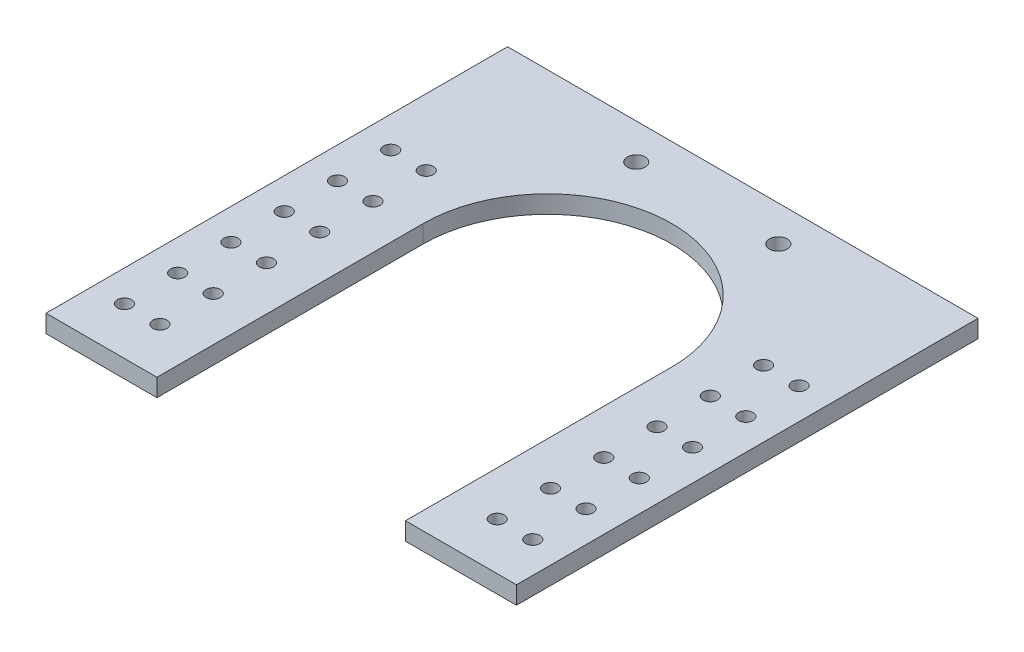
ISO-10303-21;
HEADER;
FILE_DESCRIPTION(('STEP AP214'),'2;1');
FILE_NAME('part.step','',(''),(''),'','','');
FILE_SCHEMA(('AUTOMOTIVE_DESIGN { 1 0 10303 214 1 1 1 1 }'));
ENDSEC;
DATA;
#1=APPLICATION_CONTEXT('core data for automotive mechanical design processes');
#2=APPLICATION_PROTOCOL_DEFINITION('international standard','automotive_design',2000,#1);
#3=PRODUCT_CONTEXT('',#1,'mechanical');
#4=PRODUCT('Part','Part','',(#3));
#5=PRODUCT_RELATED_PRODUCT_CATEGORY('part','',(#4));
#6=PRODUCT_DEFINITION_FORMATION('','',#4);
#7=PRODUCT_DEFINITION_CONTEXT('part definition',#1,'design');
#8=PRODUCT_DEFINITION('design','',#6,#7);
#9=PRODUCT_DEFINITION_SHAPE('','',#8);
#10=(LENGTH_UNIT() NAMED_UNIT(*) SI_UNIT(.MILLI.,.METRE.));
#11=(NAMED_UNIT(*) PLANE_ANGLE_UNIT() SI_UNIT($,.RADIAN.));
#12=(NAMED_UNIT(*) SI_UNIT($,.STERADIAN.) SOLID_ANGLE_UNIT());
#13=UNCERTAINTY_MEASURE_WITH_UNIT(LENGTH_MEASURE(1.E-05),#10,'distance_accuracy_value','');
#14=(GEOMETRIC_REPRESENTATION_CONTEXT(3) GLOBAL_UNCERTAINTY_ASSIGNED_CONTEXT((#13)) GLOBAL_UNIT_ASSIGNED_CONTEXT((#10,
#11,#12)) REPRESENTATION_CONTEXT('',''));
#15=CARTESIAN_POINT('',(0.,0.,0.));
#16=DIRECTION('',(0.,0.,1.));
#17=DIRECTION('',(1.,0.,0.));
#18=AXIS2_PLACEMENT_3D('',#15,#16,#17);
#19=CARTESIAN_POINT('',(0.,3.175,0.));
#20=DIRECTION('',(0.,-1.,0.));
#21=DIRECTION('',(0.,0.,-1.));
#22=AXIS2_PLACEMENT_3D('',#19,#20,#21);
#23=PLANE('',#22);
#24=CARTESIAN_POINT('',(60.325,3.175,8.45370510773183));
#25=DIRECTION('',(0.,1.,0.));
#26=DIRECTION('',(0.,0.,1.));
#27=AXIS2_PLACEMENT_3D('',#24,#25,#26);
#28=CIRCLE('',#27,2.55269999999999);
#29=CARTESIAN_POINT('',(60.325,3.175,11.0064051077318));
#30=VERTEX_POINT('',#29);
#31=EDGE_CURVE('E304',#30,#30,#28,.T.);
#32=ORIENTED_EDGE('',*,*,#31,.F.);
#33=EDGE_LOOP('',(#32));
#34=FACE_BOUND('',#33,.T.);
#35=CARTESIAN_POINT('',(73.025,3.175,65.6037051077318));
#36=DIRECTION('',(0.,1.,0.));
#37=DIRECTION('',(0.,0.,1.));
#38=AXIS2_PLACEMENT_3D('',#35,#36,#37);
#39=CIRCLE('',#38,2.55269999999999);
#40=CARTESIAN_POINT('',(73.025,3.175,68.1564051077318));
#41=VERTEX_POINT('',#40);
#42=EDGE_CURVE('E284',#41,#41,#39,.T.);
#43=ORIENTED_EDGE('',*,*,#42,.F.);
#44=EDGE_LOOP('',(#43));
#45=FACE_BOUND('',#44,.T.);
#46=CARTESIAN_POINT('',(60.325,3.175,65.6037051077318));
#47=DIRECTION('',(0.,1.,0.));
#48=DIRECTION('',(0.,0.,1.));
#49=AXIS2_PLACEMENT_3D('',#46,#47,#48);
#50=CIRCLE('',#49,2.55269999999999);
#51=CARTESIAN_POINT('',(60.325,3.175,68.1564051077318));
#52=VERTEX_POINT('',#51);
#53=EDGE_CURVE('E283',#52,#52,#50,.T.);
#54=ORIENTED_EDGE('',*,*,#53,.F.);
#55=EDGE_LOOP('',(#54));
#56=FACE_BOUND('',#55,.T.);
#57=CARTESIAN_POINT('',(-60.325,3.175,46.5537051077318));
#58=DIRECTION('',(0.,1.,0.));
#59=DIRECTION('',(0.,0.,1.));
#60=AXIS2_PLACEMENT_3D('',#57,#58,#59);
#61=CIRCLE('',#60,2.5527);
#62=CARTESIAN_POINT('',(-60.325,3.175,49.1064051077318));
#63=VERTEX_POINT('',#62);
#64=EDGE_CURVE('E372',#63,#63,#61,.T.);
#65=ORIENTED_EDGE('',*,*,#64,.F.);
#66=EDGE_LOOP('',(#65));
#67=FACE_BOUND('',#66,.T.);
#68=CARTESIAN_POINT('',(-73.025,3.175,46.5537051077318));
#69=DIRECTION('',(0.,1.,0.));
#70=DIRECTION('',(0.,0.,1.));
#71=AXIS2_PLACEMENT_3D('',#68,#69,#70);
#72=CIRCLE('',#71,2.55269999999999);
#73=CARTESIAN_POINT('',(-73.025,3.175,49.1064051077318));
#74=VERTEX_POINT('',#73);
#75=EDGE_CURVE('E380',#74,#74,#72,.T.);
#76=ORIENTED_EDGE('',*,*,#75,.F.);
#77=EDGE_LOOP('',(#76));
#78=FACE_BOUND('',#77,.T.);
#79=CARTESIAN_POINT('',(-73.025,3.175,65.6037051077318));
#80=DIRECTION('',(0.,1.,0.));
#81=DIRECTION('',(0.,0.,1.));
#82=AXIS2_PLACEMENT_3D('',#79,#80,#81);
#83=CIRCLE('',#82,2.55269999999999);
#84=CARTESIAN_POINT('',(-73.025,3.175,68.1564051077318));
#85=VERTEX_POINT('',#84);
#86=EDGE_CURVE('E220',#85,#85,#83,.T.);
#87=ORIENTED_EDGE('',*,*,#86,.F.);
#88=EDGE_LOOP('',(#87));
#89=FACE_BOUND('',#88,.T.);
#90=CARTESIAN_POINT('',(-60.325,3.175,65.6037051077318));
#91=DIRECTION('',(0.,1.,0.));
#92=DIRECTION('',(0.,0.,1.));
#93=AXIS2_PLACEMENT_3D('',#90,#91,#92);
#94=CIRCLE('',#93,2.5527);
#95=CARTESIAN_POINT('',(-60.325,3.175,68.1564051077318));
#96=VERTEX_POINT('',#95);
#97=EDGE_CURVE('E219',#96,#96,#94,.T.);
#98=ORIENTED_EDGE('',*,*,#97,.F.);
#99=EDGE_LOOP('',(#98));
#100=FACE_BOUND('',#99,.T.);
#101=CARTESIAN_POINT('',(-25.4,3.175,-69.85));
#102=DIRECTION('',(0.,1.,0.));
#103=DIRECTION('',(0.,0.,1.));
#104=AXIS2_PLACEMENT_3D('',#101,#102,#103);
#105=CIRCLE('',#104,3.175);
#106=CARTESIAN_POINT('',(-25.4,3.175,-66.675));
#107=VERTEX_POINT('',#106);
#108=EDGE_CURVE('E214',#107,#107,#105,.T.);
#109=ORIENTED_EDGE('',*,*,#108,.F.);
#110=EDGE_LOOP('',(#109));
#111=FACE_BOUND('',#110,.T.);
#112=CARTESIAN_POINT('',(25.4,3.175,-69.85));
#113=DIRECTION('',(0.,1.,0.));
#114=DIRECTION('',(0.,0.,1.));
#115=AXIS2_PLACEMENT_3D('',#112,#113,#114);
#116=CIRCLE('',#115,3.175);
#117=CARTESIAN_POINT('',(25.4,3.175,-66.675));
#118=VERTEX_POINT('',#117);
#119=EDGE_CURVE('E150',#118,#118,#116,.T.);
#120=ORIENTED_EDGE('',*,*,#119,.F.);
#121=EDGE_LOOP('',(#120));
#122=FACE_BOUND('',#121,.T.);
#123=DIRECTION('',(0.,0.,1.));
#124=VECTOR('',#123,1.);
#125=CARTESIAN_POINT('',(44.45,3.175,0.));
#126=LINE('',#125,#124);
#127=CARTESIAN_POINT('',(44.45,3.175,-12.7));
#128=VERTEX_POINT('',#127);
#129=CARTESIAN_POINT('',(44.45,3.175,82.55));
#130=VERTEX_POINT('',#129);
#131=EDGE_CURVE('E130',#128,#130,#126,.T.);
#132=ORIENTED_EDGE('',*,*,#131,.T.);
#133=DIRECTION('',(1.,0.,0.));
#134=VECTOR('',#133,1.);
#135=CARTESIAN_POINT('',(-84.1375,3.175,82.55));
#136=LINE('',#135,#134);
#137=CARTESIAN_POINT('',(84.1375,3.175,82.55));
#138=VERTEX_POINT('',#137);
#139=EDGE_CURVE('E179',#130,#138,#136,.T.);
#140=ORIENTED_EDGE('',*,*,#139,.T.);
#141=DIRECTION('',(0.,0.,-1.));
#142=VECTOR('',#141,1.);
#143=CARTESIAN_POINT('',(84.1375,3.175,82.55));
#144=LINE('',#143,#142);
#145=CARTESIAN_POINT('',(84.1375,3.175,-82.55));
#146=VERTEX_POINT('',#145);
#147=EDGE_CURVE('E176',#138,#146,#144,.T.);
#148=ORIENTED_EDGE('',*,*,#147,.T.);
#149=DIRECTION('',(1.,0.,0.));
#150=VECTOR('',#149,1.);
#151=CARTESIAN_POINT('',(-84.1375,3.175,-82.55));
#152=LINE('',#151,#150);
#153=CARTESIAN_POINT('',(-84.1375,3.175,-82.55));
#154=VERTEX_POINT('',#153);
#155=EDGE_CURVE('E172',#154,#146,#152,.T.);
#156=ORIENTED_EDGE('',*,*,#155,.F.);
#157=DIRECTION('',(0.,0.,-1.));
#158=VECTOR('',#157,1.);
#159=CARTESIAN_POINT('',(-84.1375,3.175,82.55));
#160=LINE('',#159,#158);
#161=CARTESIAN_POINT('',(-84.1375,3.175,82.55));
#162=VERTEX_POINT('',#161);
#163=EDGE_CURVE('E169',#162,#154,#160,.T.);
#164=ORIENTED_EDGE('',*,*,#163,.F.);
#165=CARTESIAN_POINT('',(-44.45,3.175,82.55));
#166=VERTEX_POINT('',#165);
#167=EDGE_CURVE('E180',#162,#166,#136,.T.);
#168=ORIENTED_EDGE('',*,*,#167,.T.);
#169=DIRECTION('',(0.,0.,-1.));
#170=VECTOR('',#169,1.);
#171=CARTESIAN_POINT('',(-44.45,3.175,0.));
#172=LINE('',#171,#170);
#173=CARTESIAN_POINT('',(-44.45,3.175,-12.7));
#174=VERTEX_POINT('',#173);
#175=EDGE_CURVE('E156',#166,#174,#172,.T.);
#176=ORIENTED_EDGE('',*,*,#175,.T.);
#177=CARTESIAN_POINT('',(0.,3.175,-12.7));
#178=DIRECTION('',(0.,1.,0.));
#179=DIRECTION('',(0.,0.,1.));
#180=AXIS2_PLACEMENT_3D('',#177,#178,#179);
#181=CIRCLE('',#180,44.45);
#182=EDGE_CURVE('E127',#128,#174,#181,.T.);
#183=ORIENTED_EDGE('',*,*,#182,.F.);
#184=EDGE_LOOP('',(#132,#140,#148,#156,#164,#168,#176,#183));
#185=FACE_BOUND('',#184,.T.);
#186=CARTESIAN_POINT('',(-73.025,3.175,27.5037051077318));
#187=DIRECTION('',(0.,1.,0.));
#188=DIRECTION('',(0.,0.,1.));
#189=AXIS2_PLACEMENT_3D('',#186,#187,#188);
#190=CIRCLE('',#189,2.55269999999999);
#191=CARTESIAN_POINT('',(-73.025,3.175,30.0564051077318));
#192=VERTEX_POINT('',#191);
#193=EDGE_CURVE('E224',#192,#192,#190,.T.);
#194=ORIENTED_EDGE('',*,*,#193,.F.);
#195=EDGE_LOOP('',(#194));
#196=FACE_BOUND('',#195,.T.);
#197=CARTESIAN_POINT('',(-73.025,3.175,8.45370510773183));
#198=DIRECTION('',(0.,1.,0.));
#199=DIRECTION('',(0.,0.,1.));
#200=AXIS2_PLACEMENT_3D('',#197,#198,#199);
#201=CIRCLE('',#200,2.55269999999999);
#202=CARTESIAN_POINT('',(-73.025,3.175,11.0064051077318));
#203=VERTEX_POINT('',#202);
#204=EDGE_CURVE('E232',#203,#203,#201,.T.);
#205=ORIENTED_EDGE('',*,*,#204,.F.);
#206=EDGE_LOOP('',(#205));
#207=FACE_BOUND('',#206,.T.);
#208=CARTESIAN_POINT('',(-73.025,3.175,-10.5962948922682));
#209=DIRECTION('',(0.,1.,0.));
#210=DIRECTION('',(0.,0.,1.));
#211=AXIS2_PLACEMENT_3D('',#208,#209,#210);
#212=CIRCLE('',#211,2.55269999999999);
#213=CARTESIAN_POINT('',(-73.025,3.175,-8.04359489226818));
#214=VERTEX_POINT('',#213);
#215=EDGE_CURVE('E240',#214,#214,#212,.T.);
#216=ORIENTED_EDGE('',*,*,#215,.F.);
#217=EDGE_LOOP('',(#216));
#218=FACE_BOUND('',#217,.T.);
#219=CARTESIAN_POINT('',(-73.025,3.175,-29.6462948922682));
#220=DIRECTION('',(0.,1.,0.));
#221=DIRECTION('',(0.,0.,1.));
#222=AXIS2_PLACEMENT_3D('',#219,#220,#221);
#223=CIRCLE('',#222,2.55269999999999);
#224=CARTESIAN_POINT('',(-73.025,3.175,-27.0935948922682));
#225=VERTEX_POINT('',#224);
#226=EDGE_CURVE('E248',#225,#225,#223,.T.);
#227=ORIENTED_EDGE('',*,*,#226,.F.);
#228=EDGE_LOOP('',(#227));
#229=FACE_BOUND('',#228,.T.);
#230=CARTESIAN_POINT('',(-60.325,3.175,27.5037051077318));
#231=DIRECTION('',(0.,1.,0.));
#232=DIRECTION('',(0.,0.,1.));
#233=AXIS2_PLACEMENT_3D('',#230,#231,#232);
#234=CIRCLE('',#233,2.5527);
#235=CARTESIAN_POINT('',(-60.325,3.175,30.0564051077318));
#236=VERTEX_POINT('',#235);
#237=EDGE_CURVE('E256',#236,#236,#234,.T.);
#238=ORIENTED_EDGE('',*,*,#237,.F.);
#239=EDGE_LOOP('',(#238));
#240=FACE_BOUND('',#239,.T.);
#241=CARTESIAN_POINT('',(-60.325,3.175,8.45370510773183));
#242=DIRECTION('',(0.,1.,0.));
#243=DIRECTION('',(0.,0.,1.));
#244=AXIS2_PLACEMENT_3D('',#241,#242,#243);
#245=CIRCLE('',#244,2.5527);
#246=CARTESIAN_POINT('',(-60.325,3.175,11.0064051077318));
#247=VERTEX_POINT('',#246);
#248=EDGE_CURVE('E264',#247,#247,#245,.T.);
#249=ORIENTED_EDGE('',*,*,#248,.F.);
#250=EDGE_LOOP('',(#249));
#251=FACE_BOUND('',#250,.T.);
#252=CARTESIAN_POINT('',(-60.325,3.175,-10.5962948922682));
#253=DIRECTION('',(0.,1.,0.));
#254=DIRECTION('',(0.,0.,1.));
#255=AXIS2_PLACEMENT_3D('',#252,#253,#254);
#256=CIRCLE('',#255,2.5527);
#257=CARTESIAN_POINT('',(-60.325,3.175,-8.04359489226817));
#258=VERTEX_POINT('',#257);
#259=EDGE_CURVE('E272',#258,#258,#256,.T.);
#260=ORIENTED_EDGE('',*,*,#259,.F.);
#261=EDGE_LOOP('',(#260));
#262=FACE_BOUND('',#261,.T.);
#263=CARTESIAN_POINT('',(-60.325,3.175,-29.6462948922682));
#264=DIRECTION('',(0.,1.,0.));
#265=DIRECTION('',(0.,0.,1.));
#266=AXIS2_PLACEMENT_3D('',#263,#264,#265);
#267=CIRCLE('',#266,2.5527);
#268=CARTESIAN_POINT('',(-60.325,3.175,-27.0935948922682));
#269=VERTEX_POINT('',#268);
#270=EDGE_CURVE('E11',#269,#269,#267,.T.);
#271=ORIENTED_EDGE('',*,*,#270,.F.);
#272=EDGE_LOOP('',(#271));
#273=FACE_BOUND('',#272,.T.);
#274=CARTESIAN_POINT('',(60.325,3.175,46.5537051077318));
#275=DIRECTION('',(0.,1.,0.));
#276=DIRECTION('',(0.,0.,1.));
#277=AXIS2_PLACEMENT_3D('',#274,#275,#276);
#278=CIRCLE('',#277,2.55269999999999);
#279=CARTESIAN_POINT('',(60.325,3.175,49.1064051077318));
#280=VERTEX_POINT('',#279);
#281=EDGE_CURVE('E289',#280,#280,#278,.T.);
#282=ORIENTED_EDGE('',*,*,#281,.F.);
#283=EDGE_LOOP('',(#282));
#284=FACE_BOUND('',#283,.T.);
#285=CARTESIAN_POINT('',(73.025,3.175,46.5537051077318));
#286=DIRECTION('',(0.,1.,0.));
#287=DIRECTION('',(0.,0.,1.));
#288=AXIS2_PLACEMENT_3D('',#285,#286,#287);
#289=CIRCLE('',#288,2.55269999999999);
#290=CARTESIAN_POINT('',(73.025,3.175,49.1064051077318));
#291=VERTEX_POINT('',#290);
#292=EDGE_CURVE('E290',#291,#291,#289,.T.);
#293=ORIENTED_EDGE('',*,*,#292,.F.);
#294=EDGE_LOOP('',(#293));
#295=FACE_BOUND('',#294,.T.);
#296=CARTESIAN_POINT('',(60.325,3.175,27.5037051077318));
#297=DIRECTION('',(0.,1.,0.));
#298=DIRECTION('',(0.,0.,1.));
#299=AXIS2_PLACEMENT_3D('',#296,#297,#298);
#300=CIRCLE('',#299,2.55269999999999);
#301=CARTESIAN_POINT('',(60.325,3.175,30.0564051077318));
#302=VERTEX_POINT('',#301);
#303=EDGE_CURVE('E295',#302,#302,#300,.T.);
#304=ORIENTED_EDGE('',*,*,#303,.F.);
#305=EDGE_LOOP('',(#304));
#306=FACE_BOUND('',#305,.T.);
#307=CARTESIAN_POINT('',(73.025,3.175,27.5037051077318));
#308=DIRECTION('',(0.,1.,0.));
#309=DIRECTION('',(0.,0.,1.));
#310=AXIS2_PLACEMENT_3D('',#307,#308,#309);
#311=CIRCLE('',#310,2.55269999999999);
#312=CARTESIAN_POINT('',(73.025,3.175,30.0564051077318));
#313=VERTEX_POINT('',#312);
#314=EDGE_CURVE('E300',#313,#313,#311,.T.);
#315=ORIENTED_EDGE('',*,*,#314,.F.);
#316=EDGE_LOOP('',(#315));
#317=FACE_BOUND('',#316,.T.);
#318=CARTESIAN_POINT('',(73.025,3.175,8.45370510773183));
#319=DIRECTION('',(0.,1.,0.));
#320=DIRECTION('',(0.,0.,1.));
#321=AXIS2_PLACEMENT_3D('',#318,#319,#320);
#322=CIRCLE('',#321,2.55269999999999);
#323=CARTESIAN_POINT('',(73.025,3.175,11.0064051077318));
#324=VERTEX_POINT('',#323);
#325=EDGE_CURVE('E305',#324,#324,#322,.T.);
#326=ORIENTED_EDGE('',*,*,#325,.F.);
#327=EDGE_LOOP('',(#326));
#328=FACE_BOUND('',#327,.T.);
#329=CARTESIAN_POINT('',(60.325,3.175,-10.5962948922682));
#330=DIRECTION('',(0.,1.,0.));
#331=DIRECTION('',(0.,0.,1.));
#332=AXIS2_PLACEMENT_3D('',#329,#330,#331);
#333=CIRCLE('',#332,2.55269999999999);
#334=CARTESIAN_POINT('',(60.325,3.175,-8.04359489226818));
#335=VERTEX_POINT('',#334);
#336=EDGE_CURVE('E309',#335,#335,#333,.T.);
#337=ORIENTED_EDGE('',*,*,#336,.F.);
#338=EDGE_LOOP('',(#337));
#339=FACE_BOUND('',#338,.T.);
#340=CARTESIAN_POINT('',(73.025,3.175,-10.5962948922682));
#341=DIRECTION('',(0.,1.,0.));
#342=DIRECTION('',(0.,0.,1.));
#343=AXIS2_PLACEMENT_3D('',#340,#341,#342);
#344=CIRCLE('',#343,2.55269999999999);
#345=CARTESIAN_POINT('',(73.025,3.175,-8.04359489226818));
#346=VERTEX_POINT('',#345);
#347=EDGE_CURVE('E310',#346,#346,#344,.T.);
#348=ORIENTED_EDGE('',*,*,#347,.F.);
#349=EDGE_LOOP('',(#348));
#350=FACE_BOUND('',#349,.T.);
#351=CARTESIAN_POINT('',(60.325,3.175,-29.6462948922682));
#352=DIRECTION('',(0.,1.,0.));
#353=DIRECTION('',(0.,0.,1.));
#354=AXIS2_PLACEMENT_3D('',#351,#352,#353);
#355=CIRCLE('',#354,2.55269999999999);
#356=CARTESIAN_POINT('',(60.325,3.175,-27.0935948922682));
#357=VERTEX_POINT('',#356);
#358=EDGE_CURVE('E325',#357,#357,#355,.T.);
#359=ORIENTED_EDGE('',*,*,#358,.F.);
#360=EDGE_LOOP('',(#359));
#361=FACE_BOUND('',#360,.T.);
#362=CARTESIAN_POINT('',(73.025,3.175,-29.6462948922682));
#363=DIRECTION('',(0.,1.,0.));
#364=DIRECTION('',(0.,0.,1.));
#365=AXIS2_PLACEMENT_3D('',#362,#363,#364);
#366=CIRCLE('',#365,2.55269999999999);
#367=CARTESIAN_POINT('',(73.025,3.175,-27.0935948922682));
#368=VERTEX_POINT('',#367);
#369=EDGE_CURVE('E443',#368,#368,#366,.T.);
#370=ORIENTED_EDGE('',*,*,#369,.F.);
#371=EDGE_LOOP('',(#370));
#372=FACE_BOUND('',#371,.T.);
#373=ADVANCED_FACE('F43',(#34,#45,#56,#67,#78,#89,#100,#111,#122,#185,#196,#207,#218,#229,#240,
#251,#262,#273,#284,#295,#306,#317,#328,#339,#350,#361,#372),#23,.F.);
#374=CARTESIAN_POINT('',(-60.325,3.175,-29.6462948922682));
#375=DIRECTION('',(0.,1.,0.));
#376=DIRECTION('',(0.,0.,1.));
#377=AXIS2_PLACEMENT_3D('',#374,#375,#376);
#378=CYLINDRICAL_SURFACE('',#377,2.55269999999999);
#379=CARTESIAN_POINT('',(-60.325,-3.175,-29.6462948922682));
#380=DIRECTION('',(0.,-1.,0.));
#381=DIRECTION('',(0.,0.,-1.));
#382=AXIS2_PLACEMENT_3D('',#379,#380,#381);
#383=CIRCLE('',#382,2.55269999999999);
#384=CARTESIAN_POINT('',(-60.325,-3.175,-32.1989948922682));
#385=VERTEX_POINT('',#384);
#386=EDGE_CURVE('E53',#385,#385,#383,.T.);
#387=ORIENTED_EDGE('',*,*,#386,.T.);
#388=EDGE_LOOP('',(#387));
#389=FACE_BOUND('',#388,.T.);
#390=ORIENTED_EDGE('',*,*,#270,.T.);
#391=EDGE_LOOP('',(#390));
#392=FACE_BOUND('',#391,.T.);
#393=ADVANCED_FACE('F45',(#389,#392),#378,.F.);
#394=CARTESIAN_POINT('',(-60.325,3.175,-10.5962948922682));
#395=DIRECTION('',(0.,1.,0.));
#396=DIRECTION('',(0.,0.,1.));
#397=AXIS2_PLACEMENT_3D('',#394,#395,#396);
#398=CYLINDRICAL_SURFACE('',#397,2.55269999999999);
#399=CARTESIAN_POINT('',(-60.325,-3.175,-10.5962948922682));
#400=DIRECTION('',(0.,-1.,0.));
#401=DIRECTION('',(0.,0.,-1.));
#402=AXIS2_PLACEMENT_3D('',#399,#400,#401);
#403=CIRCLE('',#402,2.55269999999999);
#404=CARTESIAN_POINT('',(-60.325,-3.175,-13.1489948922682));
#405=VERTEX_POINT('',#404);
#406=EDGE_CURVE('E268',#405,#405,#403,.T.);
#407=ORIENTED_EDGE('',*,*,#406,.T.);
#408=EDGE_LOOP('',(#407));
#409=FACE_BOUND('',#408,.T.);
#410=ORIENTED_EDGE('',*,*,#259,.T.);
#411=EDGE_LOOP('',(#410));
#412=FACE_BOUND('',#411,.T.);
#413=ADVANCED_FACE('F572',(#409,#412),#398,.F.);
#414=CARTESIAN_POINT('',(-60.325,3.175,8.45370510773183));
#415=DIRECTION('',(0.,1.,0.));
#416=DIRECTION('',(0.,0.,1.));
#417=AXIS2_PLACEMENT_3D('',#414,#415,#416);
#418=CYLINDRICAL_SURFACE('',#417,2.55269999999999);
#419=CARTESIAN_POINT('',(-60.325,-3.175,8.45370510773183));
#420=DIRECTION('',(0.,-1.,0.));
#421=DIRECTION('',(0.,0.,-1.));
#422=AXIS2_PLACEMENT_3D('',#419,#420,#421);
#423=CIRCLE('',#422,2.55269999999999);
#424=CARTESIAN_POINT('',(-60.325,-3.175,5.90100510773183));
#425=VERTEX_POINT('',#424);
#426=EDGE_CURVE('E260',#425,#425,#423,.T.);
#427=ORIENTED_EDGE('',*,*,#426,.T.);
#428=EDGE_LOOP('',(#427));
#429=FACE_BOUND('',#428,.T.);
#430=ORIENTED_EDGE('',*,*,#248,.T.);
#431=EDGE_LOOP('',(#430));
#432=FACE_BOUND('',#431,.T.);
#433=ADVANCED_FACE('F569',(#429,#432),#418,.F.);
#434=CARTESIAN_POINT('',(-60.325,3.175,27.5037051077318));
#435=DIRECTION('',(0.,1.,0.));
#436=DIRECTION('',(0.,0.,1.));
#437=AXIS2_PLACEMENT_3D('',#434,#435,#436);
#438=CYLINDRICAL_SURFACE('',#437,2.55269999999999);
#439=CARTESIAN_POINT('',(-60.325,-3.175,27.5037051077318));
#440=DIRECTION('',(0.,-1.,0.));
#441=DIRECTION('',(0.,0.,-1.));
#442=AXIS2_PLACEMENT_3D('',#439,#440,#441);
#443=CIRCLE('',#442,2.55269999999999);
#444=CARTESIAN_POINT('',(-60.325,-3.175,24.9510051077318));
#445=VERTEX_POINT('',#444);
#446=EDGE_CURVE('E252',#445,#445,#443,.T.);
#447=ORIENTED_EDGE('',*,*,#446,.T.);
#448=EDGE_LOOP('',(#447));
#449=FACE_BOUND('',#448,.T.);
#450=ORIENTED_EDGE('',*,*,#237,.T.);
#451=EDGE_LOOP('',(#450));
#452=FACE_BOUND('',#451,.T.);
#453=ADVANCED_FACE('F565',(#449,#452),#438,.F.);
#454=CARTESIAN_POINT('',(-73.025,3.175,-29.6462948922682));
#455=DIRECTION('',(0.,1.,0.));
#456=DIRECTION('',(0.,0.,1.));
#457=AXIS2_PLACEMENT_3D('',#454,#455,#456);
#458=CYLINDRICAL_SURFACE('',#457,2.55269999999999);
#459=CARTESIAN_POINT('',(-73.025,-3.175,-29.6462948922682));
#460=DIRECTION('',(0.,-1.,0.));
#461=DIRECTION('',(0.,0.,-1.));
#462=AXIS2_PLACEMENT_3D('',#459,#460,#461);
#463=CIRCLE('',#462,2.55269999999999);
#464=CARTESIAN_POINT('',(-73.025,-3.175,-32.1989948922682));
#465=VERTEX_POINT('',#464);
#466=EDGE_CURVE('E244',#465,#465,#463,.T.);
#467=ORIENTED_EDGE('',*,*,#466,.T.);
#468=EDGE_LOOP('',(#467));
#469=FACE_BOUND('',#468,.T.);
#470=ORIENTED_EDGE('',*,*,#226,.T.);
#471=EDGE_LOOP('',(#470));
#472=FACE_BOUND('',#471,.T.);
#473=ADVANCED_FACE('F561',(#469,#472),#458,.F.);
#474=CARTESIAN_POINT('',(-73.025,3.175,-10.5962948922682));
#475=DIRECTION('',(0.,1.,0.));
#476=DIRECTION('',(0.,0.,1.));
#477=AXIS2_PLACEMENT_3D('',#474,#475,#476);
#478=CYLINDRICAL_SURFACE('',#477,2.55269999999999);
#479=CARTESIAN_POINT('',(-73.025,-3.175,-10.5962948922682));
#480=DIRECTION('',(0.,-1.,0.));
#481=DIRECTION('',(0.,0.,-1.));
#482=AXIS2_PLACEMENT_3D('',#479,#480,#481);
#483=CIRCLE('',#482,2.55269999999999);
#484=CARTESIAN_POINT('',(-73.025,-3.175,-13.1489948922682));
#485=VERTEX_POINT('',#484);
#486=EDGE_CURVE('E236',#485,#485,#483,.T.);
#487=ORIENTED_EDGE('',*,*,#486,.T.);
#488=EDGE_LOOP('',(#487));
#489=FACE_BOUND('',#488,.T.);
#490=ORIENTED_EDGE('',*,*,#215,.T.);
#491=EDGE_LOOP('',(#490));
#492=FACE_BOUND('',#491,.T.);
#493=ADVANCED_FACE('F557',(#489,#492),#478,.F.);
#494=CARTESIAN_POINT('',(-73.025,3.175,8.45370510773183));
#495=DIRECTION('',(0.,1.,0.));
#496=DIRECTION('',(0.,0.,1.));
#497=AXIS2_PLACEMENT_3D('',#494,#495,#496);
#498=CYLINDRICAL_SURFACE('',#497,2.55269999999999);
#499=CARTESIAN_POINT('',(-73.025,-3.175,8.45370510773183));
#500=DIRECTION('',(0.,-1.,0.));
#501=DIRECTION('',(0.,0.,-1.));
#502=AXIS2_PLACEMENT_3D('',#499,#500,#501);
#503=CIRCLE('',#502,2.55269999999999);
#504=CARTESIAN_POINT('',(-73.025,-3.175,5.90100510773184));
#505=VERTEX_POINT('',#504);
#506=EDGE_CURVE('E228',#505,#505,#503,.T.);
#507=ORIENTED_EDGE('',*,*,#506,.T.);
#508=EDGE_LOOP('',(#507));
#509=FACE_BOUND('',#508,.T.);
#510=ORIENTED_EDGE('',*,*,#204,.T.);
#511=EDGE_LOOP('',(#510));
#512=FACE_BOUND('',#511,.T.);
#513=ADVANCED_FACE('F553',(#509,#512),#498,.F.);
#514=CARTESIAN_POINT('',(-73.025,3.175,27.5037051077318));
#515=DIRECTION('',(0.,1.,0.));
#516=DIRECTION('',(0.,0.,1.));
#517=AXIS2_PLACEMENT_3D('',#514,#515,#516);
#518=CYLINDRICAL_SURFACE('',#517,2.55269999999999);
#519=CARTESIAN_POINT('',(-73.025,-3.175,27.5037051077318));
#520=DIRECTION('',(0.,-1.,0.));
#521=DIRECTION('',(0.,0.,-1.));
#522=AXIS2_PLACEMENT_3D('',#519,#520,#521);
#523=CIRCLE('',#522,2.55269999999999);
#524=CARTESIAN_POINT('',(-73.025,-3.175,24.9510051077318));
#525=VERTEX_POINT('',#524);
#526=EDGE_CURVE('E200',#525,#525,#523,.T.);
#527=ORIENTED_EDGE('',*,*,#526,.T.);
#528=EDGE_LOOP('',(#527));
#529=FACE_BOUND('',#528,.T.);
#530=ORIENTED_EDGE('',*,*,#193,.T.);
#531=EDGE_LOOP('',(#530));
#532=FACE_BOUND('',#531,.T.);
#533=ADVANCED_FACE('F541',(#529,#532),#518,.F.);
#534=CARTESIAN_POINT('',(-84.1375,3.175,82.55));
#535=DIRECTION('',(0.,0.,-1.));
#536=DIRECTION('',(-1.,0.,0.));
#537=AXIS2_PLACEMENT_3D('',#534,#535,#536);
#538=PLANE('',#537);
#539=DIRECTION('',(0.,1.,0.));
#540=VECTOR('',#539,1.);
#541=CARTESIAN_POINT('',(44.45,-3.176,82.55));
#542=LINE('',#541,#540);
#543=CARTESIAN_POINT('',(44.45,-3.175,82.55));
#544=VERTEX_POINT('',#543);
#545=EDGE_CURVE('E164',#544,#130,#542,.T.);
#546=ORIENTED_EDGE('',*,*,#545,.F.);
#547=DIRECTION('',(1.,0.,0.));
#548=VECTOR('',#547,1.);
#549=CARTESIAN_POINT('',(-84.1375,-3.175,82.55));
#550=LINE('',#549,#548);
#551=CARTESIAN_POINT('',(84.1375,-3.175,82.55));
#552=VERTEX_POINT('',#551);
#553=EDGE_CURVE('E195',#544,#552,#550,.T.);
#554=ORIENTED_EDGE('',*,*,#553,.T.);
#555=DIRECTION('',(0.,-1.,0.));
#556=VECTOR('',#555,1.);
#557=CARTESIAN_POINT('',(84.1375,3.175,82.55));
#558=LINE('',#557,#556);
#559=EDGE_CURVE('E201',#138,#552,#558,.T.);
#560=ORIENTED_EDGE('',*,*,#559,.F.);
#561=ORIENTED_EDGE('',*,*,#139,.F.);
#562=EDGE_LOOP('',(#546,#554,#560,#561));
#563=FACE_BOUND('',#562,.T.);
#564=ADVANCED_FACE('F538',(#563),#538,.F.);
#565=DIRECTION('',(0.,1.,0.));
#566=VECTOR('',#565,1.);
#567=CARTESIAN_POINT('',(-44.45,-3.176,82.55));
#568=LINE('',#567,#566);
#569=CARTESIAN_POINT('',(-44.45,-3.175,82.55));
#570=VERTEX_POINT('',#569);
#571=EDGE_CURVE('E61',#570,#166,#568,.T.);
#572=ORIENTED_EDGE('',*,*,#571,.T.);
#573=ORIENTED_EDGE('',*,*,#167,.F.);
#574=DIRECTION('',(0.,-1.,0.));
#575=VECTOR('',#574,1.);
#576=CARTESIAN_POINT('',(-84.1375,3.175,82.55));
#577=LINE('',#576,#575);
#578=CARTESIAN_POINT('',(-84.1375,-3.175,82.55));
#579=VERTEX_POINT('',#578);
#580=EDGE_CURVE('E70',#162,#579,#577,.T.);
#581=ORIENTED_EDGE('',*,*,#580,.T.);
#582=EDGE_CURVE('E173',#579,#570,#550,.T.);
#583=ORIENTED_EDGE('',*,*,#582,.T.);
#584=EDGE_LOOP('',(#572,#573,#581,#583));
#585=FACE_BOUND('',#584,.T.);
#586=ADVANCED_FACE('F536',(#585),#538,.F.);
#587=CARTESIAN_POINT('',(0.,-3.175,0.));
#588=DIRECTION('',(0.,-1.,0.));
#589=DIRECTION('',(0.,0.,-1.));
#590=AXIS2_PLACEMENT_3D('',#587,#588,#589);
#591=PLANE('',#590);
#592=CARTESIAN_POINT('',(73.025,-3.175,-29.6462948922682));
#593=DIRECTION('',(0.,-1.,0.));
#594=DIRECTION('',(0.,0.,-1.));
#595=AXIS2_PLACEMENT_3D('',#592,#593,#594);
#596=CIRCLE('',#595,2.55269999999999);
#597=CARTESIAN_POINT('',(73.025,-3.175,-32.1989948922682));
#598=VERTEX_POINT('',#597);
#599=EDGE_CURVE('E47',#598,#598,#596,.T.);
#600=ORIENTED_EDGE('',*,*,#599,.F.);
#601=EDGE_LOOP('',(#600));
#602=FACE_BOUND('',#601,.T.);
#603=CARTESIAN_POINT('',(60.325,-3.175,-29.6462948922682));
#604=DIRECTION('',(0.,-1.,0.));
#605=DIRECTION('',(0.,0.,-1.));
#606=AXIS2_PLACEMENT_3D('',#603,#604,#605);
#607=CIRCLE('',#606,2.55269999999999);
#608=CARTESIAN_POINT('',(60.325,-3.175,-32.1989948922682));
#609=VERTEX_POINT('',#608);
#610=EDGE_CURVE('E319',#609,#609,#607,.T.);
#611=ORIENTED_EDGE('',*,*,#610,.F.);
#612=EDGE_LOOP('',(#611));
#613=FACE_BOUND('',#612,.T.);
#614=CARTESIAN_POINT('',(73.025,-3.175,-10.5962948922682));
#615=DIRECTION('',(0.,-1.,0.));
#616=DIRECTION('',(0.,0.,-1.));
#617=AXIS2_PLACEMENT_3D('',#614,#615,#616);
#618=CIRCLE('',#617,2.55269999999999);
#619=CARTESIAN_POINT('',(73.025,-3.175,-13.1489948922682));
#620=VERTEX_POINT('',#619);
#621=EDGE_CURVE('E306',#620,#620,#618,.T.);
#622=ORIENTED_EDGE('',*,*,#621,.F.);
#623=EDGE_LOOP('',(#622));
#624=FACE_BOUND('',#623,.T.);
#625=CARTESIAN_POINT('',(60.325,-3.175,-10.5962948922682));
#626=DIRECTION('',(0.,-1.,0.));
#627=DIRECTION('',(0.,0.,-1.));
#628=AXIS2_PLACEMENT_3D('',#625,#626,#627);
#629=CIRCLE('',#628,2.55269999999999);
#630=CARTESIAN_POINT('',(60.325,-3.175,-13.1489948922682));
#631=VERTEX_POINT('',#630);
#632=EDGE_CURVE('E316',#631,#631,#629,.T.);
#633=ORIENTED_EDGE('',*,*,#632,.F.);
#634=EDGE_LOOP('',(#633));
#635=FACE_BOUND('',#634,.T.);
#636=CARTESIAN_POINT('',(73.025,-3.175,8.45370510773183));
#637=DIRECTION('',(0.,-1.,0.));
#638=DIRECTION('',(0.,0.,-1.));
#639=AXIS2_PLACEMENT_3D('',#636,#637,#638);
#640=CIRCLE('',#639,2.55269999999999);
#641=CARTESIAN_POINT('',(73.025,-3.175,5.90100510773184));
#642=VERTEX_POINT('',#641);
#643=EDGE_CURVE('E301',#642,#642,#640,.T.);
#644=ORIENTED_EDGE('',*,*,#643,.F.);
#645=EDGE_LOOP('',(#644));
#646=FACE_BOUND('',#645,.T.);
#647=CARTESIAN_POINT('',(60.325,-3.175,8.45370510773183));
#648=DIRECTION('',(0.,-1.,0.));
#649=DIRECTION('',(0.,0.,-1.));
#650=AXIS2_PLACEMENT_3D('',#647,#648,#649);
#651=CIRCLE('',#650,2.55269999999999);
#652=CARTESIAN_POINT('',(60.325,-3.175,5.90100510773184));
#653=VERTEX_POINT('',#652);
#654=EDGE_CURVE('E338',#653,#653,#651,.T.);
#655=ORIENTED_EDGE('',*,*,#654,.F.);
#656=EDGE_LOOP('',(#655));
#657=FACE_BOUND('',#656,.T.);
#658=CARTESIAN_POINT('',(73.025,-3.175,27.5037051077318));
#659=DIRECTION('',(0.,-1.,0.));
#660=DIRECTION('',(0.,0.,-1.));
#661=AXIS2_PLACEMENT_3D('',#658,#659,#660);
#662=CIRCLE('',#661,2.55269999999999);
#663=CARTESIAN_POINT('',(73.025,-3.175,24.9510051077318));
#664=VERTEX_POINT('',#663);
#665=EDGE_CURVE('E296',#664,#664,#662,.T.);
#666=ORIENTED_EDGE('',*,*,#665,.F.);
#667=EDGE_LOOP('',(#666));
#668=FACE_BOUND('',#667,.T.);
#669=CARTESIAN_POINT('',(60.325,-3.175,27.5037051077318));
#670=DIRECTION('',(0.,-1.,0.));
#671=DIRECTION('',(0.,0.,-1.));
#672=AXIS2_PLACEMENT_3D('',#669,#670,#671);
#673=CIRCLE('',#672,2.55269999999999);
#674=CARTESIAN_POINT('',(60.325,-3.175,24.9510051077318));
#675=VERTEX_POINT('',#674);
#676=EDGE_CURVE('E291',#675,#675,#673,.T.);
#677=ORIENTED_EDGE('',*,*,#676,.F.);
#678=EDGE_LOOP('',(#677));
#679=FACE_BOUND('',#678,.T.);
#680=CARTESIAN_POINT('',(73.025,-3.175,46.5537051077318));
#681=DIRECTION('',(0.,-1.,0.));
#682=DIRECTION('',(0.,0.,-1.));
#683=AXIS2_PLACEMENT_3D('',#680,#681,#682);
#684=CIRCLE('',#683,2.55269999999999);
#685=CARTESIAN_POINT('',(73.025,-3.175,44.0010051077318));
#686=VERTEX_POINT('',#685);
#687=EDGE_CURVE('E285',#686,#686,#684,.T.);
#688=ORIENTED_EDGE('',*,*,#687,.F.);
#689=EDGE_LOOP('',(#688));
#690=FACE_BOUND('',#689,.T.);
#691=CARTESIAN_POINT('',(60.325,-3.175,46.5537051077318));
#692=DIRECTION('',(0.,-1.,0.));
#693=DIRECTION('',(0.,0.,-1.));
#694=AXIS2_PLACEMENT_3D('',#691,#692,#693);
#695=CIRCLE('',#694,2.55269999999999);
#696=CARTESIAN_POINT('',(60.325,-3.175,44.0010051077318));
#697=VERTEX_POINT('',#696);
#698=EDGE_CURVE('E354',#697,#697,#695,.T.);
#699=ORIENTED_EDGE('',*,*,#698,.F.);
#700=EDGE_LOOP('',(#699));
#701=FACE_BOUND('',#700,.T.);
#702=CARTESIAN_POINT('',(73.025,-3.175,65.6037051077318));
#703=DIRECTION('',(0.,-1.,0.));
#704=DIRECTION('',(0.,0.,-1.));
#705=AXIS2_PLACEMENT_3D('',#702,#703,#704);
#706=CIRCLE('',#705,2.55269999999999);
#707=CARTESIAN_POINT('',(73.025,-3.175,63.0510051077318));
#708=VERTEX_POINT('',#707);
#709=EDGE_CURVE('E279',#708,#708,#706,.T.);
#710=ORIENTED_EDGE('',*,*,#709,.F.);
#711=EDGE_LOOP('',(#710));
#712=FACE_BOUND('',#711,.T.);
#713=CARTESIAN_POINT('',(60.325,-3.175,65.6037051077318));
#714=DIRECTION('',(0.,-1.,0.));
#715=DIRECTION('',(0.,0.,-1.));
#716=AXIS2_PLACEMENT_3D('',#713,#714,#715);
#717=CIRCLE('',#716,2.55269999999999);
#718=CARTESIAN_POINT('',(60.325,-3.175,63.0510051077318));
#719=VERTEX_POINT('',#718);
#720=EDGE_CURVE('E364',#719,#719,#717,.T.);
#721=ORIENTED_EDGE('',*,*,#720,.F.);
#722=EDGE_LOOP('',(#721));
#723=FACE_BOUND('',#722,.T.);
#724=CARTESIAN_POINT('',(-60.325,-3.175,46.5537051077318));
#725=DIRECTION('',(0.,-1.,0.));
#726=DIRECTION('',(0.,0.,-1.));
#727=AXIS2_PLACEMENT_3D('',#724,#725,#726);
#728=CIRCLE('',#727,2.55269999999999);
#729=CARTESIAN_POINT('',(-60.325,-3.175,44.0010051077318));
#730=VERTEX_POINT('',#729);
#731=EDGE_CURVE('E368',#730,#730,#728,.T.);
#732=ORIENTED_EDGE('',*,*,#731,.F.);
#733=EDGE_LOOP('',(#732));
#734=FACE_BOUND('',#733,.T.);
#735=CARTESIAN_POINT('',(-73.025,-3.175,46.5537051077318));
#736=DIRECTION('',(0.,-1.,0.));
#737=DIRECTION('',(0.,0.,-1.));
#738=AXIS2_PLACEMENT_3D('',#735,#736,#737);
#739=CIRCLE('',#738,2.55269999999999);
#740=CARTESIAN_POINT('',(-73.025,-3.175,44.0010051077318));
#741=VERTEX_POINT('',#740);
#742=EDGE_CURVE('E376',#741,#741,#739,.T.);
#743=ORIENTED_EDGE('',*,*,#742,.F.);
#744=EDGE_LOOP('',(#743));
#745=FACE_BOUND('',#744,.T.);
#746=CARTESIAN_POINT('',(-73.025,-3.175,65.6037051077318));
#747=DIRECTION('',(0.,-1.,0.));
#748=DIRECTION('',(0.,0.,-1.));
#749=AXIS2_PLACEMENT_3D('',#746,#747,#748);
#750=CIRCLE('',#749,2.55269999999999);
#751=CARTESIAN_POINT('',(-73.025,-3.175,63.0510051077318));
#752=VERTEX_POINT('',#751);
#753=EDGE_CURVE('E215',#752,#752,#750,.T.);
#754=ORIENTED_EDGE('',*,*,#753,.F.);
#755=EDGE_LOOP('',(#754));
#756=FACE_BOUND('',#755,.T.);
#757=CARTESIAN_POINT('',(-60.325,-3.175,65.6037051077318));
#758=DIRECTION('',(0.,-1.,0.));
#759=DIRECTION('',(0.,0.,-1.));
#760=AXIS2_PLACEMENT_3D('',#757,#758,#759);
#761=CIRCLE('',#760,2.55269999999999);
#762=CARTESIAN_POINT('',(-60.325,-3.175,63.0510051077318));
#763=VERTEX_POINT('',#762);
#764=EDGE_CURVE('E390',#763,#763,#761,.T.);
#765=ORIENTED_EDGE('',*,*,#764,.F.);
#766=EDGE_LOOP('',(#765));
#767=FACE_BOUND('',#766,.T.);
#768=CARTESIAN_POINT('',(-25.4,-3.175,-69.85));
#769=DIRECTION('',(0.,-1.,0.));
#770=DIRECTION('',(0.,0.,-1.));
#771=AXIS2_PLACEMENT_3D('',#768,#769,#770);
#772=CIRCLE('',#771,3.175);
#773=CARTESIAN_POINT('',(-25.4,-3.175,-73.025));
#774=VERTEX_POINT('',#773);
#775=EDGE_CURVE('E210',#774,#774,#772,.T.);
#776=ORIENTED_EDGE('',*,*,#775,.F.);
#777=EDGE_LOOP('',(#776));
#778=FACE_BOUND('',#777,.T.);
#779=CARTESIAN_POINT('',(25.4,-3.175,-69.85));
#780=DIRECTION('',(0.,-1.,0.));
#781=DIRECTION('',(0.,0.,-1.));
#782=AXIS2_PLACEMENT_3D('',#779,#780,#781);
#783=CIRCLE('',#782,3.175);
#784=CARTESIAN_POINT('',(25.4,-3.175,-73.025));
#785=VERTEX_POINT('',#784);
#786=EDGE_CURVE('E144',#785,#785,#783,.T.);
#787=ORIENTED_EDGE('',*,*,#786,.F.);
#788=EDGE_LOOP('',(#787));
#789=FACE_BOUND('',#788,.T.);
#790=ORIENTED_EDGE('',*,*,#553,.F.);
#791=DIRECTION('',(0.,0.,1.));
#792=VECTOR('',#791,1.);
#793=CARTESIAN_POINT('',(44.45,-3.175,0.));
#794=LINE('',#793,#792);
#795=CARTESIAN_POINT('',(44.45,-3.175,-12.7));
#796=VERTEX_POINT('',#795);
#797=EDGE_CURVE('E142',#796,#544,#794,.T.);
#798=ORIENTED_EDGE('',*,*,#797,.F.);
#799=CARTESIAN_POINT('',(0.,-3.175,-12.7));
#800=DIRECTION('',(0.,-1.,0.));
#801=DIRECTION('',(0.,0.,-1.));
#802=AXIS2_PLACEMENT_3D('',#799,#800,#801);
#803=CIRCLE('',#802,44.45);
#804=CARTESIAN_POINT('',(-44.45,-3.175,-12.7));
#805=VERTEX_POINT('',#804);
#806=EDGE_CURVE('E124',#796,#805,#803,.F.);
#807=ORIENTED_EDGE('',*,*,#806,.T.);
#808=DIRECTION('',(0.,0.,-1.));
#809=VECTOR('',#808,1.);
#810=CARTESIAN_POINT('',(-44.45,-3.175,0.));
#811=LINE('',#810,#809);
#812=EDGE_CURVE('E132',#570,#805,#811,.T.);
#813=ORIENTED_EDGE('',*,*,#812,.F.);
#814=ORIENTED_EDGE('',*,*,#582,.F.);
#815=DIRECTION('',(0.,0.,-1.));
#816=VECTOR('',#815,1.);
#817=CARTESIAN_POINT('',(-84.1375,-3.175,82.55));
#818=LINE('',#817,#816);
#819=CARTESIAN_POINT('',(-84.1375,-3.175,-82.55));
#820=VERTEX_POINT('',#819);
#821=EDGE_CURVE('E136',#579,#820,#818,.T.);
#822=ORIENTED_EDGE('',*,*,#821,.T.);
#823=DIRECTION('',(1.,0.,0.));
#824=VECTOR('',#823,1.);
#825=CARTESIAN_POINT('',(-84.1375,-3.175,-82.55));
#826=LINE('',#825,#824);
#827=CARTESIAN_POINT('',(84.1375,-3.175,-82.55));
#828=VERTEX_POINT('',#827);
#829=EDGE_CURVE('E187',#820,#828,#826,.T.);
#830=ORIENTED_EDGE('',*,*,#829,.T.);
#831=DIRECTION('',(0.,0.,-1.));
#832=VECTOR('',#831,1.);
#833=CARTESIAN_POINT('',(84.1375,-3.175,82.55));
#834=LINE('',#833,#832);
#835=EDGE_CURVE('E191',#552,#828,#834,.T.);
#836=ORIENTED_EDGE('',*,*,#835,.F.);
#837=EDGE_LOOP('',(#790,#798,#807,#813,#814,#822,#830,#836));
#838=FACE_BOUND('',#837,.T.);
#839=ORIENTED_EDGE('',*,*,#526,.F.);
#840=EDGE_LOOP('',(#839));
#841=FACE_BOUND('',#840,.T.);
#842=ORIENTED_EDGE('',*,*,#506,.F.);
#843=EDGE_LOOP('',(#842));
#844=FACE_BOUND('',#843,.T.);
#845=ORIENTED_EDGE('',*,*,#486,.F.);
#846=EDGE_LOOP('',(#845));
#847=FACE_BOUND('',#846,.T.);
#848=ORIENTED_EDGE('',*,*,#466,.F.);
#849=EDGE_LOOP('',(#848));
#850=FACE_BOUND('',#849,.T.);
#851=ORIENTED_EDGE('',*,*,#446,.F.);
#852=EDGE_LOOP('',(#851));
#853=FACE_BOUND('',#852,.T.);
#854=ORIENTED_EDGE('',*,*,#426,.F.);
#855=EDGE_LOOP('',(#854));
#856=FACE_BOUND('',#855,.T.);
#857=ORIENTED_EDGE('',*,*,#406,.F.);
#858=EDGE_LOOP('',(#857));
#859=FACE_BOUND('',#858,.T.);
#860=ORIENTED_EDGE('',*,*,#386,.F.);
#861=EDGE_LOOP('',(#860));
#862=FACE_BOUND('',#861,.T.);
#863=ADVANCED_FACE('F140',(#602,#613,#624,#635,#646,#657,#668,#679,#690,#701,#712,#723,#734,
#745,#756,#767,#778,#789,#838,#841,#844,#847,#850,#853,#856,#859,#862),#591,.T.);
#864=CARTESIAN_POINT('',(-84.1375,3.175,82.55));
#865=DIRECTION('',(-1.,0.,0.));
#866=DIRECTION('',(0.,0.,1.));
#867=AXIS2_PLACEMENT_3D('',#864,#865,#866);
#868=PLANE('',#867);
#869=ORIENTED_EDGE('',*,*,#821,.F.);
#870=ORIENTED_EDGE('',*,*,#580,.F.);
#871=ORIENTED_EDGE('',*,*,#163,.T.);
#872=DIRECTION('',(0.,-1.,0.));
#873=VECTOR('',#872,1.);
#874=CARTESIAN_POINT('',(-84.1375,3.175,-82.55));
#875=LINE('',#874,#873);
#876=EDGE_CURVE('E96',#154,#820,#875,.T.);
#877=ORIENTED_EDGE('',*,*,#876,.T.);
#878=EDGE_LOOP('',(#869,#870,#871,#877));
#879=FACE_BOUND('',#878,.T.);
#880=ADVANCED_FACE('F535',(#879),#868,.T.);
#881=CARTESIAN_POINT('',(84.1375,3.175,82.55));
#882=DIRECTION('',(-1.,0.,0.));
#883=DIRECTION('',(0.,0.,1.));
#884=AXIS2_PLACEMENT_3D('',#881,#882,#883);
#885=PLANE('',#884);
#886=ORIENTED_EDGE('',*,*,#835,.T.);
#887=DIRECTION('',(0.,-1.,0.));
#888=VECTOR('',#887,1.);
#889=CARTESIAN_POINT('',(84.1375,3.175,-82.55));
#890=LINE('',#889,#888);
#891=EDGE_CURVE('E205',#146,#828,#890,.T.);
#892=ORIENTED_EDGE('',*,*,#891,.F.);
#893=ORIENTED_EDGE('',*,*,#147,.F.);
#894=ORIENTED_EDGE('',*,*,#559,.T.);
#895=EDGE_LOOP('',(#886,#892,#893,#894));
#896=FACE_BOUND('',#895,.T.);
#897=ADVANCED_FACE('F543',(#896),#885,.F.);
#898=CARTESIAN_POINT('',(-84.1375,3.175,-82.55));
#899=DIRECTION('',(0.,0.,-1.));
#900=DIRECTION('',(-1.,0.,0.));
#901=AXIS2_PLACEMENT_3D('',#898,#899,#900);
#902=PLANE('',#901);
#903=ORIENTED_EDGE('',*,*,#829,.F.);
#904=ORIENTED_EDGE('',*,*,#876,.F.);
#905=ORIENTED_EDGE('',*,*,#155,.T.);
#906=ORIENTED_EDGE('',*,*,#891,.T.);
#907=EDGE_LOOP('',(#903,#904,#905,#906));
#908=FACE_BOUND('',#907,.T.);
#909=ADVANCED_FACE('F531',(#908),#902,.T.);
#910=CARTESIAN_POINT('',(0.,-3.176,-12.7));
#911=DIRECTION('',(0.,1.,0.));
#912=DIRECTION('',(0.,0.,1.));
#913=AXIS2_PLACEMENT_3D('',#910,#911,#912);
#914=CYLINDRICAL_SURFACE('',#913,44.45);
#915=DIRECTION('',(0.,1.,0.));
#916=VECTOR('',#915,1.);
#917=CARTESIAN_POINT('',(44.45,-3.176,-12.7));
#918=LINE('',#917,#916);
#919=EDGE_CURVE('E137',#796,#128,#918,.T.);
#920=ORIENTED_EDGE('',*,*,#919,.T.);
#921=ORIENTED_EDGE('',*,*,#182,.T.);
#922=DIRECTION('',(0.,1.,0.));
#923=VECTOR('',#922,1.);
#924=CARTESIAN_POINT('',(-44.45,-3.176,-12.7));
#925=LINE('',#924,#923);
#926=EDGE_CURVE('E121',#805,#174,#925,.T.);
#927=ORIENTED_EDGE('',*,*,#926,.F.);
#928=ORIENTED_EDGE('',*,*,#806,.F.);
#929=EDGE_LOOP('',(#920,#921,#927,#928));
#930=FACE_BOUND('',#929,.T.);
#931=ADVANCED_FACE('F122',(#930),#914,.F.);
#932=CARTESIAN_POINT('',(44.45,-3.176,0.));
#933=DIRECTION('',(-1.,0.,0.));
#934=DIRECTION('',(0.,0.,1.));
#935=AXIS2_PLACEMENT_3D('',#932,#933,#934);
#936=PLANE('',#935);
#937=ORIENTED_EDGE('',*,*,#797,.T.);
#938=ORIENTED_EDGE('',*,*,#545,.T.);
#939=ORIENTED_EDGE('',*,*,#131,.F.);
#940=ORIENTED_EDGE('',*,*,#919,.F.);
#941=EDGE_LOOP('',(#937,#938,#939,#940));
#942=FACE_BOUND('',#941,.T.);
#943=ADVANCED_FACE('F524',(#942),#936,.T.);
#944=CARTESIAN_POINT('',(-44.45,-3.176,0.));
#945=DIRECTION('',(1.,0.,0.));
#946=DIRECTION('',(0.,0.,-1.));
#947=AXIS2_PLACEMENT_3D('',#944,#945,#946);
#948=PLANE('',#947);
#949=ORIENTED_EDGE('',*,*,#812,.T.);
#950=ORIENTED_EDGE('',*,*,#926,.T.);
#951=ORIENTED_EDGE('',*,*,#175,.F.);
#952=ORIENTED_EDGE('',*,*,#571,.F.);
#953=EDGE_LOOP('',(#949,#950,#951,#952));
#954=FACE_BOUND('',#953,.T.);
#955=ADVANCED_FACE('F133',(#954),#948,.T.);
#956=CARTESIAN_POINT('',(25.4,3.175,-69.85));
#957=DIRECTION('',(0.,1.,0.));
#958=DIRECTION('',(0.,0.,1.));
#959=AXIS2_PLACEMENT_3D('',#956,#957,#958);
#960=CYLINDRICAL_SURFACE('',#959,3.175);
#961=ORIENTED_EDGE('',*,*,#786,.T.);
#962=EDGE_LOOP('',(#961));
#963=FACE_BOUND('',#962,.T.);
#964=ORIENTED_EDGE('',*,*,#119,.T.);
#965=EDGE_LOOP('',(#964));
#966=FACE_BOUND('',#965,.T.);
#967=ADVANCED_FACE('F400',(#963,#966),#960,.F.);
#968=CARTESIAN_POINT('',(-25.4,3.175,-69.85));
#969=DIRECTION('',(0.,1.,0.));
#970=DIRECTION('',(0.,0.,1.));
#971=AXIS2_PLACEMENT_3D('',#968,#969,#970);
#972=CYLINDRICAL_SURFACE('',#971,3.175);
#973=ORIENTED_EDGE('',*,*,#775,.T.);
#974=EDGE_LOOP('',(#973));
#975=FACE_BOUND('',#974,.T.);
#976=ORIENTED_EDGE('',*,*,#108,.T.);
#977=EDGE_LOOP('',(#976));
#978=FACE_BOUND('',#977,.T.);
#979=ADVANCED_FACE('F516',(#975,#978),#972,.F.);
#980=CARTESIAN_POINT('',(-60.325,3.175,65.6037051077318));
#981=DIRECTION('',(0.,1.,0.));
#982=DIRECTION('',(0.,0.,1.));
#983=AXIS2_PLACEMENT_3D('',#980,#981,#982);
#984=CYLINDRICAL_SURFACE('',#983,2.55269999999999);
#985=ORIENTED_EDGE('',*,*,#764,.T.);
#986=EDGE_LOOP('',(#985));
#987=FACE_BOUND('',#986,.T.);
#988=ORIENTED_EDGE('',*,*,#97,.T.);
#989=EDGE_LOOP('',(#988));
#990=FACE_BOUND('',#989,.T.);
#991=ADVANCED_FACE('F512',(#987,#990),#984,.F.);
#992=CARTESIAN_POINT('',(-73.025,3.175,65.6037051077318));
#993=DIRECTION('',(0.,1.,0.));
#994=DIRECTION('',(0.,0.,1.));
#995=AXIS2_PLACEMENT_3D('',#992,#993,#994);
#996=CYLINDRICAL_SURFACE('',#995,2.55269999999999);
#997=ORIENTED_EDGE('',*,*,#753,.T.);
#998=EDGE_LOOP('',(#997));
#999=FACE_BOUND('',#998,.T.);
#1000=ORIENTED_EDGE('',*,*,#86,.T.);
#1001=EDGE_LOOP('',(#1000));
#1002=FACE_BOUND('',#1001,.T.);
#1003=ADVANCED_FACE('F508',(#999,#1002),#996,.F.);
#1004=CARTESIAN_POINT('',(-73.025,3.175,46.5537051077318));
#1005=DIRECTION('',(0.,1.,0.));
#1006=DIRECTION('',(0.,0.,1.));
#1007=AXIS2_PLACEMENT_3D('',#1004,#1005,#1006);
#1008=CYLINDRICAL_SURFACE('',#1007,2.55269999999999);
#1009=ORIENTED_EDGE('',*,*,#742,.T.);
#1010=EDGE_LOOP('',(#1009));
#1011=FACE_BOUND('',#1010,.T.);
#1012=ORIENTED_EDGE('',*,*,#75,.T.);
#1013=EDGE_LOOP('',(#1012));
#1014=FACE_BOUND('',#1013,.T.);
#1015=ADVANCED_FACE('F504',(#1011,#1014),#1008,.F.);
#1016=CARTESIAN_POINT('',(-60.325,3.175,46.5537051077318));
#1017=DIRECTION('',(0.,1.,0.));
#1018=DIRECTION('',(0.,0.,1.));
#1019=AXIS2_PLACEMENT_3D('',#1016,#1017,#1018);
#1020=CYLINDRICAL_SURFACE('',#1019,2.55269999999999);
#1021=ORIENTED_EDGE('',*,*,#731,.T.);
#1022=EDGE_LOOP('',(#1021));
#1023=FACE_BOUND('',#1022,.T.);
#1024=ORIENTED_EDGE('',*,*,#64,.T.);
#1025=EDGE_LOOP('',(#1024));
#1026=FACE_BOUND('',#1025,.T.);
#1027=ADVANCED_FACE('F500',(#1023,#1026),#1020,.F.);
#1028=CARTESIAN_POINT('',(60.325,3.175,65.6037051077318));
#1029=DIRECTION('',(0.,1.,0.));
#1030=DIRECTION('',(0.,0.,1.));
#1031=AXIS2_PLACEMENT_3D('',#1028,#1029,#1030);
#1032=CYLINDRICAL_SURFACE('',#1031,2.55269999999999);
#1033=ORIENTED_EDGE('',*,*,#720,.T.);
#1034=EDGE_LOOP('',(#1033));
#1035=FACE_BOUND('',#1034,.T.);
#1036=ORIENTED_EDGE('',*,*,#53,.T.);
#1037=EDGE_LOOP('',(#1036));
#1038=FACE_BOUND('',#1037,.T.);
#1039=ADVANCED_FACE('F496',(#1035,#1038),#1032,.F.);
#1040=CARTESIAN_POINT('',(73.025,3.175,65.6037051077318));
#1041=DIRECTION('',(0.,1.,0.));
#1042=DIRECTION('',(0.,0.,1.));
#1043=AXIS2_PLACEMENT_3D('',#1040,#1041,#1042);
#1044=CYLINDRICAL_SURFACE('',#1043,2.55269999999999);
#1045=ORIENTED_EDGE('',*,*,#709,.T.);
#1046=EDGE_LOOP('',(#1045));
#1047=FACE_BOUND('',#1046,.T.);
#1048=ORIENTED_EDGE('',*,*,#42,.T.);
#1049=EDGE_LOOP('',(#1048));
#1050=FACE_BOUND('',#1049,.T.);
#1051=ADVANCED_FACE('F492',(#1047,#1050),#1044,.F.);
#1052=CARTESIAN_POINT('',(60.325,3.175,46.5537051077318));
#1053=DIRECTION('',(0.,1.,0.));
#1054=DIRECTION('',(0.,0.,1.));
#1055=AXIS2_PLACEMENT_3D('',#1052,#1053,#1054);
#1056=CYLINDRICAL_SURFACE('',#1055,2.55269999999999);
#1057=ORIENTED_EDGE('',*,*,#698,.T.);
#1058=EDGE_LOOP('',(#1057));
#1059=FACE_BOUND('',#1058,.T.);
#1060=ORIENTED_EDGE('',*,*,#281,.T.);
#1061=EDGE_LOOP('',(#1060));
#1062=FACE_BOUND('',#1061,.T.);
#1063=ADVANCED_FACE('F488',(#1059,#1062),#1056,.F.);
#1064=CARTESIAN_POINT('',(73.025,3.175,46.5537051077318));
#1065=DIRECTION('',(0.,1.,0.));
#1066=DIRECTION('',(0.,0.,1.));
#1067=AXIS2_PLACEMENT_3D('',#1064,#1065,#1066);
#1068=CYLINDRICAL_SURFACE('',#1067,2.55269999999999);
#1069=ORIENTED_EDGE('',*,*,#687,.T.);
#1070=EDGE_LOOP('',(#1069));
#1071=FACE_BOUND('',#1070,.T.);
#1072=ORIENTED_EDGE('',*,*,#292,.T.);
#1073=EDGE_LOOP('',(#1072));
#1074=FACE_BOUND('',#1073,.T.);
#1075=ADVANCED_FACE('F484',(#1071,#1074),#1068,.F.);
#1076=CARTESIAN_POINT('',(60.325,3.175,27.5037051077318));
#1077=DIRECTION('',(0.,1.,0.));
#1078=DIRECTION('',(0.,0.,1.));
#1079=AXIS2_PLACEMENT_3D('',#1076,#1077,#1078);
#1080=CYLINDRICAL_SURFACE('',#1079,2.55269999999999);
#1081=ORIENTED_EDGE('',*,*,#676,.T.);
#1082=EDGE_LOOP('',(#1081));
#1083=FACE_BOUND('',#1082,.T.);
#1084=ORIENTED_EDGE('',*,*,#303,.T.);
#1085=EDGE_LOOP('',(#1084));
#1086=FACE_BOUND('',#1085,.T.);
#1087=ADVANCED_FACE('F480',(#1083,#1086),#1080,.F.);
#1088=CARTESIAN_POINT('',(73.025,3.175,27.5037051077318));
#1089=DIRECTION('',(0.,1.,0.));
#1090=DIRECTION('',(0.,0.,1.));
#1091=AXIS2_PLACEMENT_3D('',#1088,#1089,#1090);
#1092=CYLINDRICAL_SURFACE('',#1091,2.55269999999999);
#1093=ORIENTED_EDGE('',*,*,#665,.T.);
#1094=EDGE_LOOP('',(#1093));
#1095=FACE_BOUND('',#1094,.T.);
#1096=ORIENTED_EDGE('',*,*,#314,.T.);
#1097=EDGE_LOOP('',(#1096));
#1098=FACE_BOUND('',#1097,.T.);
#1099=ADVANCED_FACE('F476',(#1095,#1098),#1092,.F.);
#1100=CARTESIAN_POINT('',(60.325,3.175,8.45370510773183));
#1101=DIRECTION('',(0.,1.,0.));
#1102=DIRECTION('',(0.,0.,1.));
#1103=AXIS2_PLACEMENT_3D('',#1100,#1101,#1102);
#1104=CYLINDRICAL_SURFACE('',#1103,2.55269999999999);
#1105=ORIENTED_EDGE('',*,*,#654,.T.);
#1106=EDGE_LOOP('',(#1105));
#1107=FACE_BOUND('',#1106,.T.);
#1108=ORIENTED_EDGE('',*,*,#31,.T.);
#1109=EDGE_LOOP('',(#1108));
#1110=FACE_BOUND('',#1109,.T.);
#1111=ADVANCED_FACE('F472',(#1107,#1110),#1104,.F.);
#1112=CARTESIAN_POINT('',(73.025,3.175,8.45370510773183));
#1113=DIRECTION('',(0.,1.,0.));
#1114=DIRECTION('',(0.,0.,1.));
#1115=AXIS2_PLACEMENT_3D('',#1112,#1113,#1114);
#1116=CYLINDRICAL_SURFACE('',#1115,2.55269999999999);
#1117=ORIENTED_EDGE('',*,*,#643,.T.);
#1118=EDGE_LOOP('',(#1117));
#1119=FACE_BOUND('',#1118,.T.);
#1120=ORIENTED_EDGE('',*,*,#325,.T.);
#1121=EDGE_LOOP('',(#1120));
#1122=FACE_BOUND('',#1121,.T.);
#1123=ADVANCED_FACE('F468',(#1119,#1122),#1116,.F.);
#1124=CARTESIAN_POINT('',(60.325,3.175,-10.5962948922682));
#1125=DIRECTION('',(0.,1.,0.));
#1126=DIRECTION('',(0.,0.,1.));
#1127=AXIS2_PLACEMENT_3D('',#1124,#1125,#1126);
#1128=CYLINDRICAL_SURFACE('',#1127,2.55269999999999);
#1129=ORIENTED_EDGE('',*,*,#632,.T.);
#1130=EDGE_LOOP('',(#1129));
#1131=FACE_BOUND('',#1130,.T.);
#1132=ORIENTED_EDGE('',*,*,#336,.T.);
#1133=EDGE_LOOP('',(#1132));
#1134=FACE_BOUND('',#1133,.T.);
#1135=ADVANCED_FACE('F463',(#1131,#1134),#1128,.F.);
#1136=CARTESIAN_POINT('',(73.025,3.175,-10.5962948922682));
#1137=DIRECTION('',(0.,1.,0.));
#1138=DIRECTION('',(0.,0.,1.));
#1139=AXIS2_PLACEMENT_3D('',#1136,#1137,#1138);
#1140=CYLINDRICAL_SURFACE('',#1139,2.55269999999999);
#1141=ORIENTED_EDGE('',*,*,#621,.T.);
#1142=EDGE_LOOP('',(#1141));
#1143=FACE_BOUND('',#1142,.T.);
#1144=ORIENTED_EDGE('',*,*,#347,.T.);
#1145=EDGE_LOOP('',(#1144));
#1146=FACE_BOUND('',#1145,.T.);
#1147=ADVANCED_FACE('F454',(#1143,#1146),#1140,.F.);
#1148=CARTESIAN_POINT('',(60.325,3.175,-29.6462948922682));
#1149=DIRECTION('',(0.,1.,0.));
#1150=DIRECTION('',(0.,0.,1.));
#1151=AXIS2_PLACEMENT_3D('',#1148,#1149,#1150);
#1152=CYLINDRICAL_SURFACE('',#1151,2.55269999999999);
#1153=ORIENTED_EDGE('',*,*,#610,.T.);
#1154=EDGE_LOOP('',(#1153));
#1155=FACE_BOUND('',#1154,.T.);
#1156=ORIENTED_EDGE('',*,*,#358,.T.);
#1157=EDGE_LOOP('',(#1156));
#1158=FACE_BOUND('',#1157,.T.);
#1159=ADVANCED_FACE('F451',(#1155,#1158),#1152,.F.);
#1160=CARTESIAN_POINT('',(73.025,3.175,-29.6462948922682));
#1161=DIRECTION('',(0.,1.,0.));
#1162=DIRECTION('',(0.,0.,1.));
#1163=AXIS2_PLACEMENT_3D('',#1160,#1161,#1162);
#1164=CYLINDRICAL_SURFACE('',#1163,2.55269999999999);
#1165=ORIENTED_EDGE('',*,*,#599,.T.);
#1166=EDGE_LOOP('',(#1165));
#1167=FACE_BOUND('',#1166,.T.);
#1168=ORIENTED_EDGE('',*,*,#369,.T.);
#1169=EDGE_LOOP('',(#1168));
#1170=FACE_BOUND('',#1169,.T.);
#1171=ADVANCED_FACE('F453',(#1167,#1170),#1164,.F.);
#1172=CLOSED_SHELL('',(#373,#393,#413,#433,#453,#473,#493,#513,#533,#564,#586,#863,#880,#897,
#909,#931,#943,#955,#967,#979,#991,#1003,#1015,#1027,#1039,#1051,#1063,#1075,#1087,#1099,#1111,
#1123,#1135,#1147,#1159,#1171));
#1173=MANIFOLD_SOLID_BREP('B2',#1172);
#1174=ADVANCED_BREP_SHAPE_REPRESENTATION('',(#18,#1173),#14);
#1175=SHAPE_DEFINITION_REPRESENTATION(#9,#1174);
ENDSEC;
END-ISO-10303-21;
